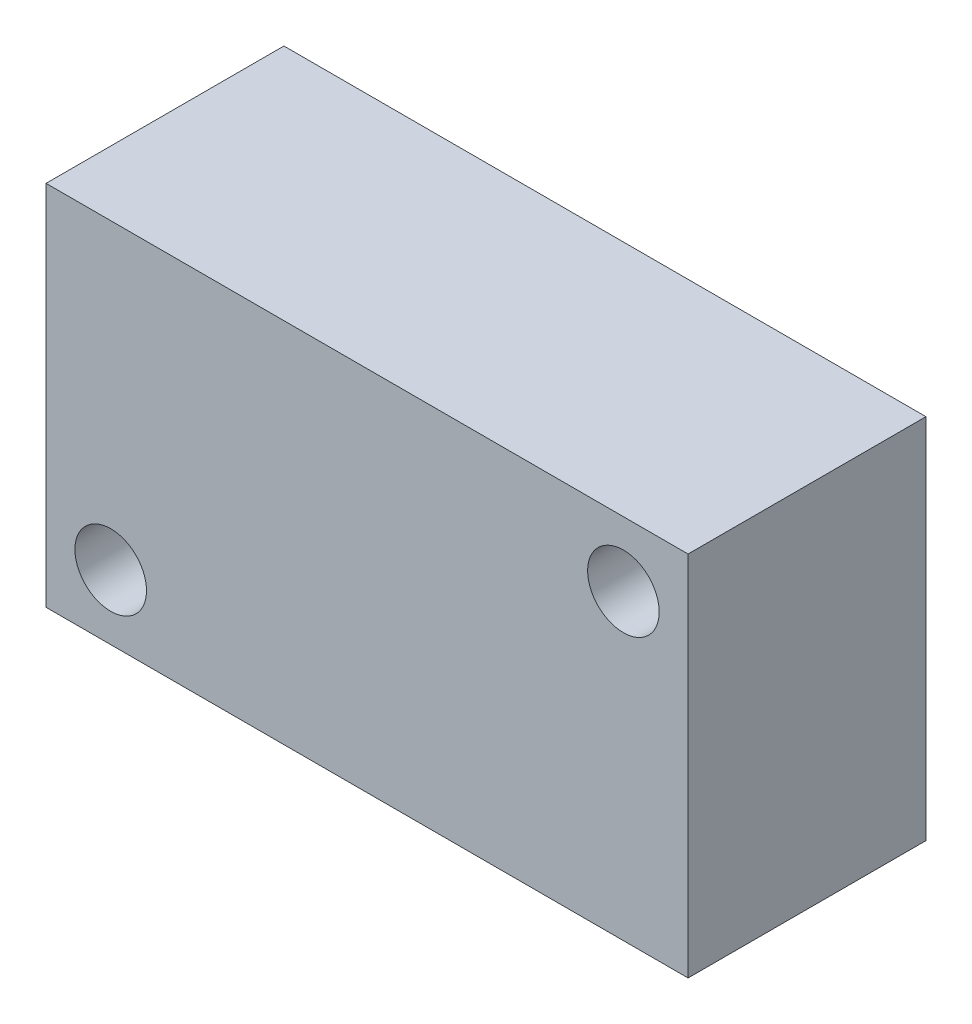
ISO-10303-21;
HEADER;
FILE_DESCRIPTION(('STEP AP214'),'2;1');
FILE_NAME('part.step','',(''),(''),'','','');
FILE_SCHEMA(('AUTOMOTIVE_DESIGN { 1 0 10303 214 1 1 1 1 }'));
ENDSEC;
DATA;
#1=APPLICATION_CONTEXT('core data for automotive mechanical design processes');
#2=APPLICATION_PROTOCOL_DEFINITION('international standard','automotive_design',2000,#1);
#3=PRODUCT_CONTEXT('',#1,'mechanical');
#4=PRODUCT('Part','Part','',(#3));
#5=PRODUCT_RELATED_PRODUCT_CATEGORY('part','',(#4));
#6=PRODUCT_DEFINITION_FORMATION('','',#4);
#7=PRODUCT_DEFINITION_CONTEXT('part definition',#1,'design');
#8=PRODUCT_DEFINITION('design','',#6,#7);
#9=PRODUCT_DEFINITION_SHAPE('','',#8);
#10=(LENGTH_UNIT() NAMED_UNIT(*) SI_UNIT(.MILLI.,.METRE.));
#11=(NAMED_UNIT(*) PLANE_ANGLE_UNIT() SI_UNIT($,.RADIAN.));
#12=(NAMED_UNIT(*) SI_UNIT($,.STERADIAN.) SOLID_ANGLE_UNIT());
#13=UNCERTAINTY_MEASURE_WITH_UNIT(LENGTH_MEASURE(1.E-05),#10,'distance_accuracy_value','');
#14=(GEOMETRIC_REPRESENTATION_CONTEXT(3) GLOBAL_UNCERTAINTY_ASSIGNED_CONTEXT((#13)) GLOBAL_UNIT_ASSIGNED_CONTEXT((#10,
#11,#12)) REPRESENTATION_CONTEXT('',''));
#15=CARTESIAN_POINT('',(0.,0.,0.));
#16=DIRECTION('',(0.,0.,1.));
#17=DIRECTION('',(1.,0.,0.));
#18=AXIS2_PLACEMENT_3D('',#15,#16,#17);
#19=CARTESIAN_POINT('',(0.,0.,10.3));
#20=DIRECTION('',(0.,0.,-1.));
#21=DIRECTION('',(-1.,0.,0.));
#22=AXIS2_PLACEMENT_3D('',#19,#20,#21);
#23=PLANE('',#22);
#24=DIRECTION('',(0.,-1.,0.));
#25=VECTOR('',#24,1.);
#26=CARTESIAN_POINT('',(0.,0.,10.3));
#27=LINE('',#26,#25);
#28=CARTESIAN_POINT('',(0.,15.9,10.3));
#29=VERTEX_POINT('',#28);
#30=CARTESIAN_POINT('',(0.,0.,10.3));
#31=VERTEX_POINT('',#30);
#32=EDGE_CURVE('E97',#29,#31,#27,.T.);
#33=ORIENTED_EDGE('',*,*,#32,.T.);
#34=DIRECTION('',(1.,0.,0.));
#35=VECTOR('',#34,1.);
#36=CARTESIAN_POINT('',(0.,0.,10.3));
#37=LINE('',#36,#35);
#38=CARTESIAN_POINT('',(27.8,0.,10.3));
#39=VERTEX_POINT('',#38);
#40=EDGE_CURVE('E92',#31,#39,#37,.T.);
#41=ORIENTED_EDGE('',*,*,#40,.T.);
#42=DIRECTION('',(0.,1.,0.));
#43=VECTOR('',#42,1.);
#44=CARTESIAN_POINT('',(27.8,0.,10.3));
#45=LINE('',#44,#43);
#46=CARTESIAN_POINT('',(27.8,15.9,10.3));
#47=VERTEX_POINT('',#46);
#48=EDGE_CURVE('E95',#39,#47,#45,.T.);
#49=ORIENTED_EDGE('',*,*,#48,.T.);
#50=DIRECTION('',(-1.,0.,0.));
#51=VECTOR('',#50,1.);
#52=CARTESIAN_POINT('',(0.,15.9,10.3));
#53=LINE('',#52,#51);
#54=EDGE_CURVE('E62',#47,#29,#53,.T.);
#55=ORIENTED_EDGE('',*,*,#54,.T.);
#56=EDGE_LOOP('',(#33,#41,#49,#55));
#57=FACE_BOUND('',#56,.T.);
#58=CARTESIAN_POINT('',(2.8,2.80000000000001,10.3));
#59=DIRECTION('',(0.,0.,1.));
#60=DIRECTION('',(1.,0.,0.));
#61=AXIS2_PLACEMENT_3D('',#58,#59,#60);
#62=CIRCLE('',#61,1.55);
#63=CARTESIAN_POINT('',(1.25,2.80000000000001,10.3));
#64=VERTEX_POINT('',#63);
#65=EDGE_CURVE('E117',#64,#64,#62,.T.);
#66=ORIENTED_EDGE('',*,*,#65,.F.);
#67=EDGE_LOOP('',(#66));
#68=FACE_BOUND('',#67,.T.);
#69=CARTESIAN_POINT('',(25.,13.1,10.3));
#70=DIRECTION('',(0.,0.,1.));
#71=DIRECTION('',(1.,0.,0.));
#72=AXIS2_PLACEMENT_3D('',#69,#70,#71);
#73=CIRCLE('',#72,1.55);
#74=CARTESIAN_POINT('',(23.45,13.1,10.3));
#75=VERTEX_POINT('',#74);
#76=EDGE_CURVE('E139',#75,#75,#73,.T.);
#77=ORIENTED_EDGE('',*,*,#76,.F.);
#78=EDGE_LOOP('',(#77));
#79=FACE_BOUND('',#78,.T.);
#80=ADVANCED_FACE('F44',(#57,#68,#79),#23,.F.);
#81=CARTESIAN_POINT('',(0.,0.,0.));
#82=DIRECTION('',(0.,0.,-1.));
#83=DIRECTION('',(-1.,0.,0.));
#84=AXIS2_PLACEMENT_3D('',#81,#82,#83);
#85=PLANE('',#84);
#86=CARTESIAN_POINT('',(2.8,2.80000000000001,0.));
#87=DIRECTION('',(0.,0.,1.));
#88=DIRECTION('',(1.,0.,0.));
#89=AXIS2_PLACEMENT_3D('',#86,#87,#88);
#90=CIRCLE('',#89,1.55);
#91=CARTESIAN_POINT('',(1.25,2.80000000000001,0.));
#92=VERTEX_POINT('',#91);
#93=EDGE_CURVE('E135',#92,#92,#90,.T.);
#94=ORIENTED_EDGE('',*,*,#93,.T.);
#95=EDGE_LOOP('',(#94));
#96=FACE_BOUND('',#95,.T.);
#97=DIRECTION('',(0.,-1.,0.));
#98=VECTOR('',#97,1.);
#99=CARTESIAN_POINT('',(0.,0.,0.));
#100=LINE('',#99,#98);
#101=CARTESIAN_POINT('',(0.,15.9,0.));
#102=VERTEX_POINT('',#101);
#103=CARTESIAN_POINT('',(0.,0.,0.));
#104=VERTEX_POINT('',#103);
#105=EDGE_CURVE('E113',#102,#104,#100,.T.);
#106=ORIENTED_EDGE('',*,*,#105,.F.);
#107=DIRECTION('',(-1.,0.,0.));
#108=VECTOR('',#107,1.);
#109=CARTESIAN_POINT('',(0.,15.9,0.));
#110=LINE('',#109,#108);
#111=CARTESIAN_POINT('',(27.8,15.9,0.));
#112=VERTEX_POINT('',#111);
#113=EDGE_CURVE('E85',#112,#102,#110,.T.);
#114=ORIENTED_EDGE('',*,*,#113,.F.);
#115=DIRECTION('',(0.,1.,0.));
#116=VECTOR('',#115,1.);
#117=CARTESIAN_POINT('',(27.8,0.,0.));
#118=LINE('',#117,#116);
#119=CARTESIAN_POINT('',(27.8,0.,0.));
#120=VERTEX_POINT('',#119);
#121=EDGE_CURVE('E79',#120,#112,#118,.T.);
#122=ORIENTED_EDGE('',*,*,#121,.F.);
#123=DIRECTION('',(1.,0.,0.));
#124=VECTOR('',#123,1.);
#125=CARTESIAN_POINT('',(0.,0.,0.));
#126=LINE('',#125,#124);
#127=EDGE_CURVE('E102',#104,#120,#126,.T.);
#128=ORIENTED_EDGE('',*,*,#127,.F.);
#129=EDGE_LOOP('',(#106,#114,#122,#128));
#130=FACE_BOUND('',#129,.T.);
#131=CARTESIAN_POINT('',(25.,13.1,0.));
#132=DIRECTION('',(0.,0.,1.));
#133=DIRECTION('',(1.,0.,0.));
#134=AXIS2_PLACEMENT_3D('',#131,#132,#133);
#135=CIRCLE('',#134,1.55);
#136=CARTESIAN_POINT('',(23.45,13.1,0.));
#137=VERTEX_POINT('',#136);
#138=EDGE_CURVE('E143',#137,#137,#135,.T.);
#139=ORIENTED_EDGE('',*,*,#138,.T.);
#140=EDGE_LOOP('',(#139));
#141=FACE_BOUND('',#140,.T.);
#142=ADVANCED_FACE('F130',(#96,#130,#141),#85,.T.);
#143=CARTESIAN_POINT('',(0.,0.,10.3));
#144=DIRECTION('',(1.,0.,0.));
#145=DIRECTION('',(0.,1.,0.));
#146=AXIS2_PLACEMENT_3D('',#143,#144,#145);
#147=PLANE('',#146);
#148=ORIENTED_EDGE('',*,*,#105,.T.);
#149=DIRECTION('',(0.,0.,-1.));
#150=VECTOR('',#149,1.);
#151=CARTESIAN_POINT('',(0.,0.,10.3));
#152=LINE('',#151,#150);
#153=EDGE_CURVE('E11',#31,#104,#152,.T.);
#154=ORIENTED_EDGE('',*,*,#153,.F.);
#155=ORIENTED_EDGE('',*,*,#32,.F.);
#156=DIRECTION('',(0.,0.,-1.));
#157=VECTOR('',#156,1.);
#158=CARTESIAN_POINT('',(0.,15.9,10.3));
#159=LINE('',#158,#157);
#160=EDGE_CURVE('E109',#29,#102,#159,.T.);
#161=ORIENTED_EDGE('',*,*,#160,.T.);
#162=EDGE_LOOP('',(#148,#154,#155,#161));
#163=FACE_BOUND('',#162,.T.);
#164=ADVANCED_FACE('F46',(#163),#147,.F.);
#165=CARTESIAN_POINT('',(0.,0.,10.3));
#166=DIRECTION('',(0.,1.,0.));
#167=DIRECTION('',(0.,0.,1.));
#168=AXIS2_PLACEMENT_3D('',#165,#166,#167);
#169=PLANE('',#168);
#170=ORIENTED_EDGE('',*,*,#127,.T.);
#171=DIRECTION('',(0.,0.,-1.));
#172=VECTOR('',#171,1.);
#173=CARTESIAN_POINT('',(27.8,0.,10.3));
#174=LINE('',#173,#172);
#175=EDGE_CURVE('E54',#39,#120,#174,.T.);
#176=ORIENTED_EDGE('',*,*,#175,.F.);
#177=ORIENTED_EDGE('',*,*,#40,.F.);
#178=ORIENTED_EDGE('',*,*,#153,.T.);
#179=EDGE_LOOP('',(#170,#176,#177,#178));
#180=FACE_BOUND('',#179,.T.);
#181=ADVANCED_FACE('F101',(#180),#169,.F.);
#182=CARTESIAN_POINT('',(27.8,0.,10.3));
#183=DIRECTION('',(-1.,0.,0.));
#184=DIRECTION('',(0.,-1.,0.));
#185=AXIS2_PLACEMENT_3D('',#182,#183,#184);
#186=PLANE('',#185);
#187=ORIENTED_EDGE('',*,*,#121,.T.);
#188=DIRECTION('',(0.,0.,-1.));
#189=VECTOR('',#188,1.);
#190=CARTESIAN_POINT('',(27.8,15.9,10.3));
#191=LINE('',#190,#189);
#192=EDGE_CURVE('E104',#47,#112,#191,.T.);
#193=ORIENTED_EDGE('',*,*,#192,.F.);
#194=ORIENTED_EDGE('',*,*,#48,.F.);
#195=ORIENTED_EDGE('',*,*,#175,.T.);
#196=EDGE_LOOP('',(#187,#193,#194,#195));
#197=FACE_BOUND('',#196,.T.);
#198=ADVANCED_FACE('F105',(#197),#186,.F.);
#199=CARTESIAN_POINT('',(0.,15.9,10.3));
#200=DIRECTION('',(0.,-1.,0.));
#201=DIRECTION('',(0.,0.,-1.));
#202=AXIS2_PLACEMENT_3D('',#199,#200,#201);
#203=PLANE('',#202);
#204=ORIENTED_EDGE('',*,*,#113,.T.);
#205=ORIENTED_EDGE('',*,*,#160,.F.);
#206=ORIENTED_EDGE('',*,*,#54,.F.);
#207=ORIENTED_EDGE('',*,*,#192,.T.);
#208=EDGE_LOOP('',(#204,#205,#206,#207));
#209=FACE_BOUND('',#208,.T.);
#210=ADVANCED_FACE('F127',(#209),#203,.F.);
#211=CARTESIAN_POINT('',(2.8,2.80000000000001,10.3));
#212=DIRECTION('',(0.,0.,-1.));
#213=DIRECTION('',(-1.,0.,0.));
#214=AXIS2_PLACEMENT_3D('',#211,#212,#213);
#215=CYLINDRICAL_SURFACE('',#214,1.55);
#216=CARTESIAN_POINT('',(1.25,2.80000000000001,10.3));
#217=CARTESIAN_POINT('',(1.25,2.80000000000001,10.1927083333333));
#218=CARTESIAN_POINT('',(1.25,2.80000000000001,10.0854166666667));
#219=CARTESIAN_POINT('',(1.25,2.80000000000001,9.87083333333333));
#220=CARTESIAN_POINT('',(1.25,2.80000000000001,9.76354166666667));
#221=CARTESIAN_POINT('',(1.25,2.80000000000001,9.54895833333333));
#222=CARTESIAN_POINT('',(1.25,2.80000000000001,9.44166666666667));
#223=CARTESIAN_POINT('',(1.25,2.80000000000001,9.22708333333333));
#224=CARTESIAN_POINT('',(1.25,2.80000000000001,9.11979166666667));
#225=CARTESIAN_POINT('',(1.25,2.80000000000001,8.90520833333333));
#226=CARTESIAN_POINT('',(1.25,2.80000000000001,8.79791666666667));
#227=CARTESIAN_POINT('',(1.25,2.80000000000001,8.58333333333333));
#228=CARTESIAN_POINT('',(1.25,2.80000000000001,8.47604166666667));
#229=CARTESIAN_POINT('',(1.25,2.80000000000001,8.26145833333333));
#230=CARTESIAN_POINT('',(1.25,2.80000000000001,8.15416666666667));
#231=CARTESIAN_POINT('',(1.25,2.80000000000001,7.93958333333333));
#232=CARTESIAN_POINT('',(1.25,2.80000000000001,7.83229166666667));
#233=CARTESIAN_POINT('',(1.25,2.80000000000001,7.61770833333333));
#234=CARTESIAN_POINT('',(1.25,2.80000000000001,7.51041666666667));
#235=CARTESIAN_POINT('',(1.25,2.80000000000001,7.29583333333333));
#236=CARTESIAN_POINT('',(1.25,2.80000000000001,7.18854166666666));
#237=CARTESIAN_POINT('',(1.25,2.80000000000001,6.97395833333333));
#238=CARTESIAN_POINT('',(1.25,2.80000000000001,6.86666666666667));
#239=CARTESIAN_POINT('',(1.25,2.80000000000001,6.65208333333333));
#240=CARTESIAN_POINT('',(1.25,2.80000000000001,6.54479166666667));
#241=CARTESIAN_POINT('',(1.25,2.80000000000001,6.33020833333333));
#242=CARTESIAN_POINT('',(1.25,2.80000000000001,6.22291666666667));
#243=CARTESIAN_POINT('',(1.25,2.80000000000001,6.00833333333333));
#244=CARTESIAN_POINT('',(1.25,2.80000000000001,5.90104166666667));
#245=CARTESIAN_POINT('',(1.25,2.80000000000001,5.68645833333333));
#246=CARTESIAN_POINT('',(1.25,2.80000000000001,5.57916666666667));
#247=CARTESIAN_POINT('',(1.25,2.80000000000001,5.36458333333333));
#248=CARTESIAN_POINT('',(1.25,2.80000000000001,5.25729166666667));
#249=CARTESIAN_POINT('',(1.25,2.80000000000001,5.04270833333333));
#250=CARTESIAN_POINT('',(1.25,2.80000000000001,4.93541666666667));
#251=CARTESIAN_POINT('',(1.25,2.80000000000001,4.72083333333333));
#252=CARTESIAN_POINT('',(1.25,2.80000000000001,4.61354166666666));
#253=CARTESIAN_POINT('',(1.25,2.80000000000001,4.39895833333333));
#254=CARTESIAN_POINT('',(1.25,2.80000000000001,4.29166666666667));
#255=CARTESIAN_POINT('',(1.25,2.80000000000001,4.07708333333333));
#256=CARTESIAN_POINT('',(1.25,2.80000000000001,3.96979166666666));
#257=CARTESIAN_POINT('',(1.25,2.80000000000001,3.75520833333333));
#258=CARTESIAN_POINT('',(1.25,2.80000000000001,3.64791666666666));
#259=CARTESIAN_POINT('',(1.25,2.80000000000001,3.43333333333333));
#260=CARTESIAN_POINT('',(1.25,2.80000000000001,3.32604166666666));
#261=CARTESIAN_POINT('',(1.25,2.80000000000001,3.11145833333333));
#262=CARTESIAN_POINT('',(1.25,2.80000000000001,3.00416666666666));
#263=CARTESIAN_POINT('',(1.25,2.80000000000001,2.78958333333333));
#264=CARTESIAN_POINT('',(1.25,2.80000000000001,2.68229166666666));
#265=CARTESIAN_POINT('',(1.25,2.80000000000001,2.46770833333333));
#266=CARTESIAN_POINT('',(1.25,2.80000000000001,2.36041666666667));
#267=CARTESIAN_POINT('',(1.25,2.80000000000001,2.14583333333333));
#268=CARTESIAN_POINT('',(1.25,2.80000000000001,2.03854166666667));
#269=CARTESIAN_POINT('',(1.25,2.80000000000001,1.82395833333333));
#270=CARTESIAN_POINT('',(1.25,2.80000000000001,1.71666666666667));
#271=CARTESIAN_POINT('',(1.25,2.80000000000001,1.50208333333333));
#272=CARTESIAN_POINT('',(1.25,2.80000000000001,1.39479166666667));
#273=CARTESIAN_POINT('',(1.25,2.80000000000001,1.18020833333333));
#274=CARTESIAN_POINT('',(1.25,2.80000000000001,1.07291666666667));
#275=CARTESIAN_POINT('',(1.25,2.80000000000001,0.858333333333333));
#276=CARTESIAN_POINT('',(1.25,2.80000000000001,0.751041666666665));
#277=CARTESIAN_POINT('',(1.25,2.80000000000001,0.536458333333331));
#278=CARTESIAN_POINT('',(1.25,2.80000000000001,0.429166666666664));
#279=CARTESIAN_POINT('',(1.25,2.80000000000001,0.214583333333331));
#280=CARTESIAN_POINT('',(1.25,2.80000000000001,0.107291666666665));
#281=CARTESIAN_POINT('',(1.25,2.80000000000001,0.));
#282=B_SPLINE_CURVE_WITH_KNOTS('',3,(#216,#217,#218,#219,#220,#221,#222,#223,#224,#225,#226,
#227,#228,#229,#230,#231,#232,#233,#234,#235,#236,#237,#238,#239,#240,#241,#242,#243,#244,#245,
#246,#247,#248,#249,#250,#251,#252,#253,#254,#255,#256,#257,#258,#259,#260,#261,#262,#263,#264,
#265,#266,#267,#268,#269,#270,#271,#272,#273,#274,#275,#276,#277,#278,#279,#280,#281),
.UNSPECIFIED.,.F.,.F.,(4,2,2,2,2,2,2,2,2,2,2,2,2,2,2,2,2,2,2,2,2,2,2,2,2,2,2,2,2,2,2,2,4),(0.,
0.321875000000001,0.64375,0.965625000000001,1.2875,1.609375,1.93125,2.253125,2.575,2.896875,
3.21875,3.540625,3.8625,4.184375,4.50625,4.828125,5.15,5.471875,5.79375,6.115625,6.4375,
6.759375,7.08125,7.403125,7.725,8.046875,8.36875,8.690625,9.0125,9.334375,9.65625,9.978125,
10.3),.UNSPECIFIED.);
#283=EDGE_CURVE('BSEAM162',#64,#92,#282,.T.);
#284=ORIENTED_EDGE('',*,*,#65,.T.);
#285=ORIENTED_EDGE('',*,*,#93,.F.);
#286=ORIENTED_EDGE('',*,*,#283,.T.);
#287=ORIENTED_EDGE('',*,*,#283,.F.);
#288=EDGE_LOOP('',(#284,#286,#285,#287));
#289=FACE_BOUND('',#288,.T.);
#290=ADVANCED_FACE('F162',(#289),#215,.F.);
#291=CARTESIAN_POINT('',(25.,13.1,10.3));
#292=DIRECTION('',(0.,0.,-1.));
#293=DIRECTION('',(-1.,0.,0.));
#294=AXIS2_PLACEMENT_3D('',#291,#292,#293);
#295=CYLINDRICAL_SURFACE('',#294,1.55);
#296=CARTESIAN_POINT('',(23.45,13.1,10.3));
#297=CARTESIAN_POINT('',(23.45,13.1,10.1927083333333));
#298=CARTESIAN_POINT('',(23.45,13.1,10.0854166666667));
#299=CARTESIAN_POINT('',(23.45,13.1,9.87083333333333));
#300=CARTESIAN_POINT('',(23.45,13.1,9.76354166666667));
#301=CARTESIAN_POINT('',(23.45,13.1,9.54895833333333));
#302=CARTESIAN_POINT('',(23.45,13.1,9.44166666666667));
#303=CARTESIAN_POINT('',(23.45,13.1,9.22708333333333));
#304=CARTESIAN_POINT('',(23.45,13.1,9.11979166666667));
#305=CARTESIAN_POINT('',(23.45,13.1,8.90520833333333));
#306=CARTESIAN_POINT('',(23.45,13.1,8.79791666666667));
#307=CARTESIAN_POINT('',(23.45,13.1,8.58333333333333));
#308=CARTESIAN_POINT('',(23.45,13.1,8.47604166666667));
#309=CARTESIAN_POINT('',(23.45,13.1,8.26145833333333));
#310=CARTESIAN_POINT('',(23.45,13.1,8.15416666666667));
#311=CARTESIAN_POINT('',(23.45,13.1,7.93958333333333));
#312=CARTESIAN_POINT('',(23.45,13.1,7.83229166666667));
#313=CARTESIAN_POINT('',(23.45,13.1,7.61770833333333));
#314=CARTESIAN_POINT('',(23.45,13.1,7.51041666666667));
#315=CARTESIAN_POINT('',(23.45,13.1,7.29583333333333));
#316=CARTESIAN_POINT('',(23.45,13.1,7.18854166666666));
#317=CARTESIAN_POINT('',(23.45,13.1,6.97395833333333));
#318=CARTESIAN_POINT('',(23.45,13.1,6.86666666666667));
#319=CARTESIAN_POINT('',(23.45,13.1,6.65208333333333));
#320=CARTESIAN_POINT('',(23.45,13.1,6.54479166666667));
#321=CARTESIAN_POINT('',(23.45,13.1,6.33020833333333));
#322=CARTESIAN_POINT('',(23.45,13.1,6.22291666666667));
#323=CARTESIAN_POINT('',(23.45,13.1,6.00833333333333));
#324=CARTESIAN_POINT('',(23.45,13.1,5.90104166666667));
#325=CARTESIAN_POINT('',(23.45,13.1,5.68645833333333));
#326=CARTESIAN_POINT('',(23.45,13.1,5.57916666666667));
#327=CARTESIAN_POINT('',(23.45,13.1,5.36458333333333));
#328=CARTESIAN_POINT('',(23.45,13.1,5.25729166666667));
#329=CARTESIAN_POINT('',(23.45,13.1,5.04270833333333));
#330=CARTESIAN_POINT('',(23.45,13.1,4.93541666666667));
#331=CARTESIAN_POINT('',(23.45,13.1,4.72083333333333));
#332=CARTESIAN_POINT('',(23.45,13.1,4.61354166666666));
#333=CARTESIAN_POINT('',(23.45,13.1,4.39895833333333));
#334=CARTESIAN_POINT('',(23.45,13.1,4.29166666666667));
#335=CARTESIAN_POINT('',(23.45,13.1,4.07708333333333));
#336=CARTESIAN_POINT('',(23.45,13.1,3.96979166666666));
#337=CARTESIAN_POINT('',(23.45,13.1,3.75520833333333));
#338=CARTESIAN_POINT('',(23.45,13.1,3.64791666666666));
#339=CARTESIAN_POINT('',(23.45,13.1,3.43333333333333));
#340=CARTESIAN_POINT('',(23.45,13.1,3.32604166666666));
#341=CARTESIAN_POINT('',(23.45,13.1,3.11145833333333));
#342=CARTESIAN_POINT('',(23.45,13.1,3.00416666666666));
#343=CARTESIAN_POINT('',(23.45,13.1,2.78958333333333));
#344=CARTESIAN_POINT('',(23.45,13.1,2.68229166666666));
#345=CARTESIAN_POINT('',(23.45,13.1,2.46770833333333));
#346=CARTESIAN_POINT('',(23.45,13.1,2.36041666666667));
#347=CARTESIAN_POINT('',(23.45,13.1,2.14583333333333));
#348=CARTESIAN_POINT('',(23.45,13.1,2.03854166666667));
#349=CARTESIAN_POINT('',(23.45,13.1,1.82395833333333));
#350=CARTESIAN_POINT('',(23.45,13.1,1.71666666666667));
#351=CARTESIAN_POINT('',(23.45,13.1,1.50208333333333));
#352=CARTESIAN_POINT('',(23.45,13.1,1.39479166666667));
#353=CARTESIAN_POINT('',(23.45,13.1,1.18020833333333));
#354=CARTESIAN_POINT('',(23.45,13.1,1.07291666666667));
#355=CARTESIAN_POINT('',(23.45,13.1,0.858333333333333));
#356=CARTESIAN_POINT('',(23.45,13.1,0.751041666666665));
#357=CARTESIAN_POINT('',(23.45,13.1,0.536458333333331));
#358=CARTESIAN_POINT('',(23.45,13.1,0.429166666666664));
#359=CARTESIAN_POINT('',(23.45,13.1,0.214583333333331));
#360=CARTESIAN_POINT('',(23.45,13.1,0.107291666666665));
#361=CARTESIAN_POINT('',(23.45,13.1,0.));
#362=B_SPLINE_CURVE_WITH_KNOTS('',3,(#296,#297,#298,#299,#300,#301,#302,#303,#304,#305,#306,
#307,#308,#309,#310,#311,#312,#313,#314,#315,#316,#317,#318,#319,#320,#321,#322,#323,#324,#325,
#326,#327,#328,#329,#330,#331,#332,#333,#334,#335,#336,#337,#338,#339,#340,#341,#342,#343,#344,
#345,#346,#347,#348,#349,#350,#351,#352,#353,#354,#355,#356,#357,#358,#359,#360,#361),
.UNSPECIFIED.,.F.,.F.,(4,2,2,2,2,2,2,2,2,2,2,2,2,2,2,2,2,2,2,2,2,2,2,2,2,2,2,2,2,2,2,2,4),(0.,
0.321875000000001,0.64375,0.965625000000001,1.2875,1.609375,1.93125,2.253125,2.575,2.896875,
3.21875,3.540625,3.8625,4.184375,4.50625,4.828125,5.15,5.471875,5.79375,6.115625,6.4375,
6.759375,7.08125,7.403125,7.725,8.046875,8.36875,8.690625,9.0125,9.334375,9.65625,9.978125,
10.3),.UNSPECIFIED.);
#363=EDGE_CURVE('BSEAM151',#75,#137,#362,.T.);
#364=ORIENTED_EDGE('',*,*,#76,.T.);
#365=ORIENTED_EDGE('',*,*,#138,.F.);
#366=ORIENTED_EDGE('',*,*,#363,.T.);
#367=ORIENTED_EDGE('',*,*,#363,.F.);
#368=EDGE_LOOP('',(#364,#366,#365,#367));
#369=FACE_BOUND('',#368,.T.);
#370=ADVANCED_FACE('F151',(#369),#295,.F.);
#371=CLOSED_SHELL('',(#80,#142,#164,#181,#198,#210,#290,#370));
#372=MANIFOLD_SOLID_BREP('B2',#371);
#373=ADVANCED_BREP_SHAPE_REPRESENTATION('',(#18,#372),#14);
#374=SHAPE_DEFINITION_REPRESENTATION(#9,#373);
ENDSEC;
END-ISO-10303-21;
